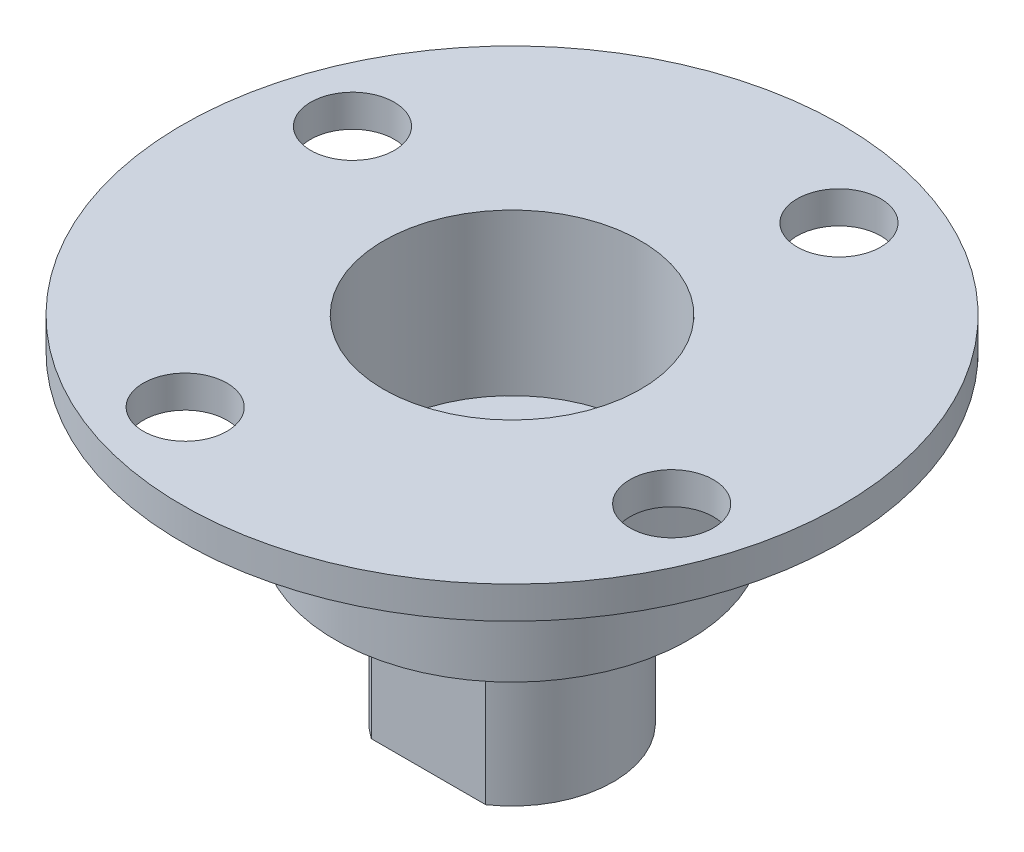
ISO-10303-21;
HEADER;
FILE_DESCRIPTION(('STEP AP214'),'2;1');
FILE_NAME('part.step','',(''),(''),'','','');
FILE_SCHEMA(('AUTOMOTIVE_DESIGN { 1 0 10303 214 1 1 1 1 }'));
ENDSEC;
DATA;
#1=APPLICATION_CONTEXT('core data for automotive mechanical design processes');
#2=APPLICATION_PROTOCOL_DEFINITION('international standard','automotive_design',2000,#1);
#3=PRODUCT_CONTEXT('',#1,'mechanical');
#4=PRODUCT('Part','Part','',(#3));
#5=PRODUCT_RELATED_PRODUCT_CATEGORY('part','',(#4));
#6=PRODUCT_DEFINITION_FORMATION('','',#4);
#7=PRODUCT_DEFINITION_CONTEXT('part definition',#1,'design');
#8=PRODUCT_DEFINITION('design','',#6,#7);
#9=PRODUCT_DEFINITION_SHAPE('','',#8);
#10=(LENGTH_UNIT() NAMED_UNIT(*) SI_UNIT(.MILLI.,.METRE.));
#11=(NAMED_UNIT(*) PLANE_ANGLE_UNIT() SI_UNIT($,.RADIAN.));
#12=(NAMED_UNIT(*) SI_UNIT($,.STERADIAN.) SOLID_ANGLE_UNIT());
#13=UNCERTAINTY_MEASURE_WITH_UNIT(LENGTH_MEASURE(1.E-05),#10,'distance_accuracy_value','');
#14=(GEOMETRIC_REPRESENTATION_CONTEXT(3) GLOBAL_UNCERTAINTY_ASSIGNED_CONTEXT((#13)) GLOBAL_UNIT_ASSIGNED_CONTEXT((#10,
#11,#12)) REPRESENTATION_CONTEXT('',''));
#15=CARTESIAN_POINT('',(0.,0.,0.));
#16=DIRECTION('',(0.,0.,1.));
#17=DIRECTION('',(1.,0.,0.));
#18=AXIS2_PLACEMENT_3D('',#15,#16,#17);
#19=CARTESIAN_POINT('',(14.017249305254,-39.6012905750699,17.2499999999998));
#20=DIRECTION('',(0.,1.,0.));
#21=DIRECTION('',(0.,0.,1.));
#22=AXIS2_PLACEMENT_3D('',#19,#20,#21);
#23=CYLINDRICAL_SURFACE('',#22,10.25);
#24=CARTESIAN_POINT('',(14.017249305254,-39.6012905750699,17.2499999999998));
#25=DIRECTION('',(0.,-1.,0.));
#26=DIRECTION('',(0.,0.,-1.));
#27=AXIS2_PLACEMENT_3D('',#24,#25,#26);
#28=CIRCLE('',#27,10.25);
#29=CARTESIAN_POINT('',(14.017249305254,-39.6012905750697,6.99999999999979));
#30=VERTEX_POINT('',#29);
#31=EDGE_CURVE('E136',#30,#30,#28,.T.);
#32=ORIENTED_EDGE('',*,*,#31,.F.);
#33=EDGE_LOOP('',(#32));
#34=FACE_BOUND('',#33,.T.);
#35=CARTESIAN_POINT('',(14.017249305254,-38.6012905750699,17.2499999999998));
#36=DIRECTION('',(0.,-1.,0.));
#37=DIRECTION('',(0.,0.,-1.));
#38=AXIS2_PLACEMENT_3D('',#35,#36,#37);
#39=CIRCLE('',#38,10.25);
#40=CARTESIAN_POINT('',(14.017249305254,-38.6012905750697,6.99999999999981));
#41=VERTEX_POINT('',#40);
#42=EDGE_CURVE('E135',#41,#41,#39,.T.);
#43=ORIENTED_EDGE('',*,*,#42,.T.);
#44=EDGE_LOOP('',(#43));
#45=FACE_BOUND('',#44,.T.);
#46=ADVANCED_FACE('F39',(#34,#45),#23,.T.);
#47=CARTESIAN_POINT('',(14.017249305254,-39.6012905750699,17.2499999999998));
#48=DIRECTION('',(0.,-1.,0.));
#49=DIRECTION('',(0.,0.,-1.));
#50=AXIS2_PLACEMENT_3D('',#47,#48,#49);
#51=PLANE('',#50);
#52=CARTESIAN_POINT('',(14.017249305254,-39.6012905750699,17.2499999999998));
#53=DIRECTION('',(0.,-1.,0.));
#54=DIRECTION('',(0.,0.,-1.));
#55=AXIS2_PLACEMENT_3D('',#52,#53,#54);
#56=CIRCLE('',#55,6.00000000000029);
#57=CARTESIAN_POINT('',(14.017249305254,-39.6012905750698,11.2499999999995));
#58=VERTEX_POINT('',#57);
#59=EDGE_CURVE('E11',#58,#58,#56,.F.);
#60=ORIENTED_EDGE('',*,*,#59,.T.);
#61=EDGE_LOOP('',(#60));
#62=FACE_BOUND('',#61,.T.);
#63=CARTESIAN_POINT('',(21.5823670466117,-39.6012905750699,19.8517289557862));
#64=DIRECTION('',(0.,-1.,0.));
#65=DIRECTION('',(0.,0.,-1.));
#66=AXIS2_PLACEMENT_3D('',#63,#64,#65);
#67=CIRCLE('',#66,1.3);
#68=CARTESIAN_POINT('',(21.5823670466117,-39.6012905750699,18.5517289557862));
#69=VERTEX_POINT('',#68);
#70=EDGE_CURVE('E103',#69,#69,#67,.T.);
#71=ORIENTED_EDGE('',*,*,#70,.F.);
#72=EDGE_LOOP('',(#71));
#73=FACE_BOUND('',#72,.T.);
#74=CARTESIAN_POINT('',(16.6189782610404,-39.6012905750698,9.68488225864214));
#75=DIRECTION('',(0.,-1.,0.));
#76=DIRECTION('',(0.,0.,-1.));
#77=AXIS2_PLACEMENT_3D('',#74,#75,#76);
#78=CIRCLE('',#77,1.3);
#79=CARTESIAN_POINT('',(16.6189782610404,-39.6012905750698,8.38488225864214));
#80=VERTEX_POINT('',#79);
#81=EDGE_CURVE('E111',#80,#80,#78,.T.);
#82=ORIENTED_EDGE('',*,*,#81,.F.);
#83=EDGE_LOOP('',(#82));
#84=FACE_BOUND('',#83,.T.);
#85=CARTESIAN_POINT('',(6.45213156389637,-39.6012905750698,14.6482710442134));
#86=DIRECTION('',(0.,-1.,0.));
#87=DIRECTION('',(0.,0.,-1.));
#88=AXIS2_PLACEMENT_3D('',#85,#86,#87);
#89=CIRCLE('',#88,1.3);
#90=CARTESIAN_POINT('',(6.45213156389637,-39.6012905750698,13.3482710442134));
#91=VERTEX_POINT('',#90);
#92=EDGE_CURVE('E119',#91,#91,#89,.T.);
#93=ORIENTED_EDGE('',*,*,#92,.F.);
#94=EDGE_LOOP('',(#93));
#95=FACE_BOUND('',#94,.T.);
#96=CARTESIAN_POINT('',(11.4155203494677,-39.60129057507,24.8151177413574));
#97=DIRECTION('',(0.,-1.,0.));
#98=DIRECTION('',(0.,0.,-1.));
#99=AXIS2_PLACEMENT_3D('',#96,#97,#98);
#100=CIRCLE('',#99,1.3);
#101=CARTESIAN_POINT('',(11.4155203494677,-39.60129057507,23.5151177413575));
#102=VERTEX_POINT('',#101);
#103=EDGE_CURVE('E127',#102,#102,#100,.T.);
#104=ORIENTED_EDGE('',*,*,#103,.F.);
#105=EDGE_LOOP('',(#104));
#106=FACE_BOUND('',#105,.T.);
#107=ORIENTED_EDGE('',*,*,#31,.T.);
#108=EDGE_LOOP('',(#107));
#109=FACE_BOUND('',#108,.T.);
#110=ADVANCED_FACE('F162',(#62,#73,#84,#95,#106,#109),#51,.T.);
#111=CARTESIAN_POINT('',(14.017249305254,-38.6012905750699,17.2499999999998));
#112=DIRECTION('',(0.,-1.,0.));
#113=DIRECTION('',(0.,0.,-1.));
#114=AXIS2_PLACEMENT_3D('',#111,#112,#113);
#115=PLANE('',#114);
#116=CARTESIAN_POINT('',(14.017249305254,-38.6012905750699,17.2499999999998));
#117=DIRECTION('',(0.,1.,0.));
#118=DIRECTION('',(0.,0.,1.));
#119=AXIS2_PLACEMENT_3D('',#116,#117,#118);
#120=CIRCLE('',#119,4.);
#121=CARTESIAN_POINT('',(14.017249305254,-38.6012905750699,21.2499999999998));
#122=VERTEX_POINT('',#121);
#123=EDGE_CURVE('E88',#122,#122,#120,.T.);
#124=ORIENTED_EDGE('',*,*,#123,.F.);
#125=EDGE_LOOP('',(#124));
#126=FACE_BOUND('',#125,.T.);
#127=CARTESIAN_POINT('',(21.5823670466117,-38.6012905750699,19.8517289557862));
#128=DIRECTION('',(0.,-1.,0.));
#129=DIRECTION('',(0.,0.,-1.));
#130=AXIS2_PLACEMENT_3D('',#127,#128,#129);
#131=CIRCLE('',#130,1.3);
#132=CARTESIAN_POINT('',(21.5823670466117,-38.6012905750699,18.5517289557862));
#133=VERTEX_POINT('',#132);
#134=EDGE_CURVE('E107',#133,#133,#131,.T.);
#135=ORIENTED_EDGE('',*,*,#134,.T.);
#136=EDGE_LOOP('',(#135));
#137=FACE_BOUND('',#136,.T.);
#138=CARTESIAN_POINT('',(16.6189782610404,-38.6012905750698,9.68488225864214));
#139=DIRECTION('',(0.,-1.,0.));
#140=DIRECTION('',(0.,0.,-1.));
#141=AXIS2_PLACEMENT_3D('',#138,#139,#140);
#142=CIRCLE('',#141,1.3);
#143=CARTESIAN_POINT('',(16.6189782610404,-38.6012905750698,8.38488225864214));
#144=VERTEX_POINT('',#143);
#145=EDGE_CURVE('E115',#144,#144,#142,.T.);
#146=ORIENTED_EDGE('',*,*,#145,.T.);
#147=EDGE_LOOP('',(#146));
#148=FACE_BOUND('',#147,.T.);
#149=CARTESIAN_POINT('',(6.45213156389637,-38.6012905750698,14.6482710442134));
#150=DIRECTION('',(0.,-1.,0.));
#151=DIRECTION('',(0.,0.,-1.));
#152=AXIS2_PLACEMENT_3D('',#149,#150,#151);
#153=CIRCLE('',#152,1.3);
#154=CARTESIAN_POINT('',(6.45213156389637,-38.6012905750698,13.3482710442134));
#155=VERTEX_POINT('',#154);
#156=EDGE_CURVE('E123',#155,#155,#153,.T.);
#157=ORIENTED_EDGE('',*,*,#156,.T.);
#158=EDGE_LOOP('',(#157));
#159=FACE_BOUND('',#158,.T.);
#160=CARTESIAN_POINT('',(11.4155203494677,-38.60129057507,24.8151177413574));
#161=DIRECTION('',(0.,-1.,0.));
#162=DIRECTION('',(0.,0.,-1.));
#163=AXIS2_PLACEMENT_3D('',#160,#161,#162);
#164=CIRCLE('',#163,1.3);
#165=CARTESIAN_POINT('',(11.4155203494677,-38.60129057507,23.5151177413575));
#166=VERTEX_POINT('',#165);
#167=EDGE_CURVE('E131',#166,#166,#164,.T.);
#168=ORIENTED_EDGE('',*,*,#167,.T.);
#169=EDGE_LOOP('',(#168));
#170=FACE_BOUND('',#169,.T.);
#171=ORIENTED_EDGE('',*,*,#42,.F.);
#172=EDGE_LOOP('',(#171));
#173=FACE_BOUND('',#172,.T.);
#174=ADVANCED_FACE('F167',(#126,#137,#148,#159,#170,#173),#115,.F.);
#175=CARTESIAN_POINT('',(11.4155203494677,-39.60129057507,24.8151177413574));
#176=DIRECTION('',(0.,-1.,0.));
#177=DIRECTION('',(0.,0.,-1.));
#178=AXIS2_PLACEMENT_3D('',#175,#176,#177);
#179=CYLINDRICAL_SURFACE('',#178,1.3);
#180=ORIENTED_EDGE('',*,*,#167,.F.);
#181=EDGE_LOOP('',(#180));
#182=FACE_BOUND('',#181,.T.);
#183=ORIENTED_EDGE('',*,*,#103,.T.);
#184=EDGE_LOOP('',(#183));
#185=FACE_BOUND('',#184,.T.);
#186=ADVANCED_FACE('F174',(#182,#185),#179,.F.);
#187=CARTESIAN_POINT('',(6.45213156389637,-39.6012905750698,14.6482710442134));
#188=DIRECTION('',(0.,-1.,0.));
#189=DIRECTION('',(0.,0.,-1.));
#190=AXIS2_PLACEMENT_3D('',#187,#188,#189);
#191=CYLINDRICAL_SURFACE('',#190,1.3);
#192=ORIENTED_EDGE('',*,*,#156,.F.);
#193=EDGE_LOOP('',(#192));
#194=FACE_BOUND('',#193,.T.);
#195=ORIENTED_EDGE('',*,*,#92,.T.);
#196=EDGE_LOOP('',(#195));
#197=FACE_BOUND('',#196,.T.);
#198=ADVANCED_FACE('F179',(#194,#197),#191,.F.);
#199=CARTESIAN_POINT('',(16.6189782610404,-39.6012905750698,9.68488225864214));
#200=DIRECTION('',(0.,-1.,0.));
#201=DIRECTION('',(0.,0.,-1.));
#202=AXIS2_PLACEMENT_3D('',#199,#200,#201);
#203=CYLINDRICAL_SURFACE('',#202,1.3);
#204=ORIENTED_EDGE('',*,*,#145,.F.);
#205=EDGE_LOOP('',(#204));
#206=FACE_BOUND('',#205,.T.);
#207=ORIENTED_EDGE('',*,*,#81,.T.);
#208=EDGE_LOOP('',(#207));
#209=FACE_BOUND('',#208,.T.);
#210=ADVANCED_FACE('F183',(#206,#209),#203,.F.);
#211=CARTESIAN_POINT('',(21.5823670466117,-39.6012905750699,19.8517289557862));
#212=DIRECTION('',(0.,-1.,0.));
#213=DIRECTION('',(0.,0.,-1.));
#214=AXIS2_PLACEMENT_3D('',#211,#212,#213);
#215=CYLINDRICAL_SURFACE('',#214,1.3);
#216=ORIENTED_EDGE('',*,*,#134,.F.);
#217=EDGE_LOOP('',(#216));
#218=FACE_BOUND('',#217,.T.);
#219=ORIENTED_EDGE('',*,*,#70,.T.);
#220=EDGE_LOOP('',(#219));
#221=FACE_BOUND('',#220,.T.);
#222=ADVANCED_FACE('F187',(#218,#221),#215,.F.);
#223=CARTESIAN_POINT('',(14.017249305254,-44.6012905750699,17.2499999999997));
#224=DIRECTION('',(0.,1.,0.));
#225=DIRECTION('',(0.,0.,1.));
#226=AXIS2_PLACEMENT_3D('',#223,#224,#225);
#227=CYLINDRICAL_SURFACE('',#226,5.50000000000029);
#228=CARTESIAN_POINT('',(14.017249305254,-40.1012905750699,17.2499999999998));
#229=DIRECTION('',(0.,-1.,0.));
#230=DIRECTION('',(0.,0.,-1.));
#231=AXIS2_PLACEMENT_3D('',#228,#229,#230);
#232=CIRCLE('',#231,5.50000000000029);
#233=CARTESIAN_POINT('',(14.017249305254,-40.1012905750698,11.7499999999995));
#234=VERTEX_POINT('',#233);
#235=EDGE_CURVE('E48',#234,#234,#232,.T.);
#236=ORIENTED_EDGE('',*,*,#235,.T.);
#237=EDGE_LOOP('',(#236));
#238=FACE_BOUND('',#237,.T.);
#239=CARTESIAN_POINT('',(14.017249305254,-44.6012905750699,17.2499999999997));
#240=DIRECTION('',(0.,-1.,0.));
#241=DIRECTION('',(0.,0.,-1.));
#242=AXIS2_PLACEMENT_3D('',#239,#240,#241);
#243=CIRCLE('',#242,5.50000000000029);
#244=CARTESIAN_POINT('',(14.017249305254,-44.6012905750698,11.7499999999994));
#245=VERTEX_POINT('',#244);
#246=EDGE_CURVE('E96',#245,#245,#243,.T.);
#247=ORIENTED_EDGE('',*,*,#246,.F.);
#248=EDGE_LOOP('',(#247));
#249=FACE_BOUND('',#248,.T.);
#250=ADVANCED_FACE('F146',(#238,#249),#227,.T.);
#251=CARTESIAN_POINT('',(14.017249305254,-44.6012905750699,17.2499999999997));
#252=DIRECTION('',(0.,-1.,0.));
#253=DIRECTION('',(0.,0.,-1.));
#254=AXIS2_PLACEMENT_3D('',#251,#252,#253);
#255=PLANE('',#254);
#256=CARTESIAN_POINT('',(14.017249305254,-44.6012905750699,17.2499999999997));
#257=DIRECTION('',(0.,-1.,0.));
#258=DIRECTION('',(0.,0.,-1.));
#259=AXIS2_PLACEMENT_3D('',#256,#257,#258);
#260=CIRCLE('',#259,3.15);
#261=CARTESIAN_POINT('',(12.2389073808761,-44.6012905750699,19.8499999999997));
#262=VERTEX_POINT('',#261);
#263=CARTESIAN_POINT('',(15.7955912296319,-44.6012905750699,19.8499999999997));
#264=VERTEX_POINT('',#263);
#265=EDGE_CURVE('E67',#262,#264,#260,.T.);
#266=ORIENTED_EDGE('',*,*,#265,.F.);
#267=DIRECTION('',(-1.,0.,0.));
#268=VECTOR('',#267,1.);
#269=CARTESIAN_POINT('',(12.2389073808761,-44.6012905750699,19.8499999999997));
#270=LINE('',#269,#268);
#271=EDGE_CURVE('E54',#264,#262,#270,.T.);
#272=ORIENTED_EDGE('',*,*,#271,.F.);
#273=EDGE_LOOP('',(#266,#272));
#274=FACE_BOUND('',#273,.T.);
#275=ORIENTED_EDGE('',*,*,#246,.T.);
#276=EDGE_LOOP('',(#275));
#277=FACE_BOUND('',#276,.T.);
#278=ADVANCED_FACE('F68',(#274,#277),#255,.T.);
#279=CARTESIAN_POINT('',(14.017249305254,-40.1012905750699,17.2499999999998));
#280=DIRECTION('',(0.,-1.,0.));
#281=DIRECTION('',(0.,0.,-1.));
#282=AXIS2_PLACEMENT_3D('',#279,#280,#281);
#283=TOROIDAL_SURFACE('',#282,6.00000000000029,0.5);
#284=ORIENTED_EDGE('',*,*,#59,.F.);
#285=EDGE_LOOP('',(#284));
#286=FACE_BOUND('',#285,.T.);
#287=ORIENTED_EDGE('',*,*,#235,.F.);
#288=EDGE_LOOP('',(#287));
#289=FACE_BOUND('',#288,.T.);
#290=ADVANCED_FACE('F41',(#286,#289),#283,.F.);
#291=CARTESIAN_POINT('',(14.017249305254,-43.6012905750699,17.2499999999997));
#292=DIRECTION('',(0.,1.,0.));
#293=DIRECTION('',(0.,0.,1.));
#294=AXIS2_PLACEMENT_3D('',#291,#292,#293);
#295=CYLINDRICAL_SURFACE('',#294,4.);
#296=CARTESIAN_POINT('',(14.017249305254,-43.6012905750699,17.2499999999997));
#297=DIRECTION('',(0.,1.,0.));
#298=DIRECTION('',(0.,0.,1.));
#299=AXIS2_PLACEMENT_3D('',#296,#297,#298);
#300=CIRCLE('',#299,4.);
#301=CARTESIAN_POINT('',(14.017249305254,-43.6012905750699,21.2499999999997));
#302=VERTEX_POINT('',#301);
#303=EDGE_CURVE('E92',#302,#302,#300,.T.);
#304=ORIENTED_EDGE('',*,*,#303,.F.);
#305=EDGE_LOOP('',(#304));
#306=FACE_BOUND('',#305,.T.);
#307=ORIENTED_EDGE('',*,*,#123,.T.);
#308=EDGE_LOOP('',(#307));
#309=FACE_BOUND('',#308,.T.);
#310=ADVANCED_FACE('F150',(#306,#309),#295,.F.);
#311=CARTESIAN_POINT('',(14.017249305254,-43.6012905750699,17.2499999999997));
#312=DIRECTION('',(0.,1.,0.));
#313=DIRECTION('',(0.,0.,1.));
#314=AXIS2_PLACEMENT_3D('',#311,#312,#313);
#315=PLANE('',#314);
#316=ORIENTED_EDGE('',*,*,#303,.T.);
#317=EDGE_LOOP('',(#316));
#318=FACE_BOUND('',#317,.T.);
#319=ADVANCED_FACE('F156',(#318),#315,.T.);
#320=CARTESIAN_POINT('',(14.017249305254,-49.6012905750699,17.2499999999997));
#321=DIRECTION('',(0.,1.,0.));
#322=DIRECTION('',(0.,0.,1.));
#323=AXIS2_PLACEMENT_3D('',#320,#321,#322);
#324=CYLINDRICAL_SURFACE('',#323,3.15);
#325=ORIENTED_EDGE('',*,*,#265,.T.);
#326=DIRECTION('',(0.,1.,0.));
#327=VECTOR('',#326,1.);
#328=CARTESIAN_POINT('',(15.7955912296319,-49.6012905750699,19.8499999999997));
#329=LINE('',#328,#327);
#330=CARTESIAN_POINT('',(15.7955912296319,-49.6012905750699,19.8499999999997));
#331=VERTEX_POINT('',#330);
#332=EDGE_CURVE('E79',#331,#264,#329,.T.);
#333=ORIENTED_EDGE('',*,*,#332,.F.);
#334=CARTESIAN_POINT('',(14.017249305254,-49.6012905750699,17.2499999999997));
#335=DIRECTION('',(0.,-1.,0.));
#336=DIRECTION('',(0.,0.,-1.));
#337=AXIS2_PLACEMENT_3D('',#334,#335,#336);
#338=CIRCLE('',#337,3.15);
#339=CARTESIAN_POINT('',(12.2389073808761,-49.6012905750699,19.8499999999997));
#340=VERTEX_POINT('',#339);
#341=EDGE_CURVE('E81',#340,#331,#338,.T.);
#342=ORIENTED_EDGE('',*,*,#341,.F.);
#343=DIRECTION('',(0.,1.,0.));
#344=VECTOR('',#343,1.);
#345=CARTESIAN_POINT('',(12.2389073808761,-49.6012905750699,19.8499999999997));
#346=LINE('',#345,#344);
#347=EDGE_CURVE('E77',#340,#262,#346,.T.);
#348=ORIENTED_EDGE('',*,*,#347,.T.);
#349=EDGE_LOOP('',(#325,#333,#342,#348));
#350=FACE_BOUND('',#349,.T.);
#351=ADVANCED_FACE('F83',(#350),#324,.T.);
#352=CARTESIAN_POINT('',(12.2389073808761,-49.6012905750699,19.8499999999997));
#353=DIRECTION('',(0.,0.,-1.));
#354=DIRECTION('',(0.,1.,0.));
#355=AXIS2_PLACEMENT_3D('',#352,#353,#354);
#356=PLANE('',#355);
#357=ORIENTED_EDGE('',*,*,#271,.T.);
#358=ORIENTED_EDGE('',*,*,#347,.F.);
#359=DIRECTION('',(-1.,0.,0.));
#360=VECTOR('',#359,1.);
#361=CARTESIAN_POINT('',(12.2389073808761,-49.6012905750699,19.8499999999997));
#362=LINE('',#361,#360);
#363=EDGE_CURVE('E62',#331,#340,#362,.T.);
#364=ORIENTED_EDGE('',*,*,#363,.F.);
#365=ORIENTED_EDGE('',*,*,#332,.T.);
#366=EDGE_LOOP('',(#357,#358,#364,#365));
#367=FACE_BOUND('',#366,.T.);
#368=ADVANCED_FACE('F76',(#367),#356,.F.);
#369=CARTESIAN_POINT('',(14.017249305254,-49.6012905750699,17.2499999999997));
#370=DIRECTION('',(0.,-1.,0.));
#371=DIRECTION('',(0.,0.,-1.));
#372=AXIS2_PLACEMENT_3D('',#369,#370,#371);
#373=PLANE('',#372);
#374=ORIENTED_EDGE('',*,*,#341,.T.);
#375=ORIENTED_EDGE('',*,*,#363,.T.);
#376=EDGE_LOOP('',(#374,#375));
#377=FACE_BOUND('',#376,.T.);
#378=ADVANCED_FACE('F201',(#377),#373,.T.);
#379=CLOSED_SHELL('',(#46,#110,#174,#186,#198,#210,#222,#250,#278,#290,#310,#319,#351,#368,#378));
#380=MANIFOLD_SOLID_BREP('B2',#379);
#381=ADVANCED_BREP_SHAPE_REPRESENTATION('',(#18,#380),#14);
#382=SHAPE_DEFINITION_REPRESENTATION(#9,#381);
ENDSEC;
END-ISO-10303-21;
